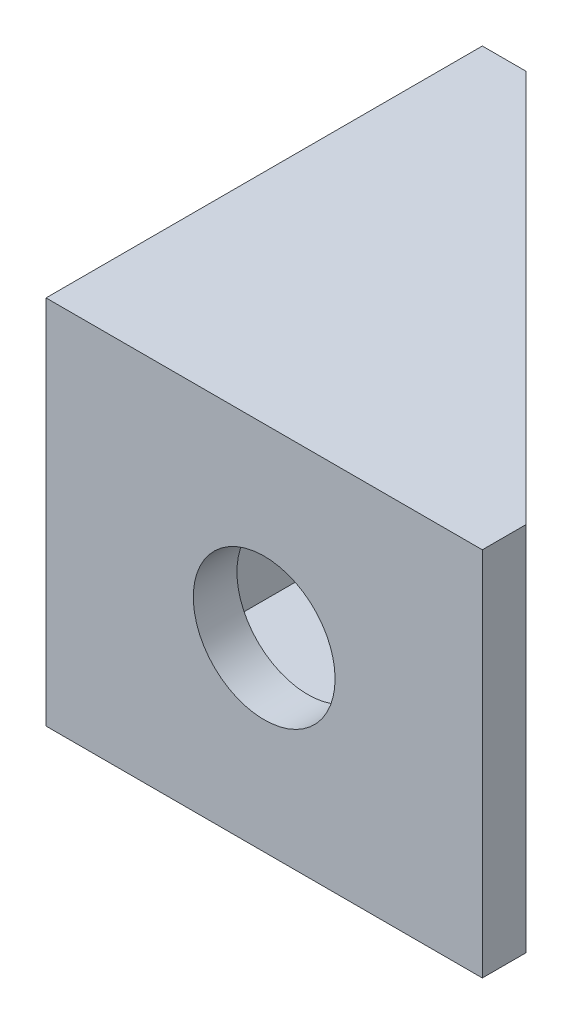
ISO-10303-21;
HEADER;
FILE_DESCRIPTION(('STEP AP214'),'2;1');
FILE_NAME('part.step','',(''),(''),'','','');
FILE_SCHEMA(('AUTOMOTIVE_DESIGN { 1 0 10303 214 1 1 1 1 }'));
ENDSEC;
DATA;
#1=APPLICATION_CONTEXT('core data for automotive mechanical design processes');
#2=APPLICATION_PROTOCOL_DEFINITION('international standard','automotive_design',2000,#1);
#3=PRODUCT_CONTEXT('',#1,'mechanical');
#4=PRODUCT('Part','Part','',(#3));
#5=PRODUCT_RELATED_PRODUCT_CATEGORY('part','',(#4));
#6=PRODUCT_DEFINITION_FORMATION('','',#4);
#7=PRODUCT_DEFINITION_CONTEXT('part definition',#1,'design');
#8=PRODUCT_DEFINITION('design','',#6,#7);
#9=PRODUCT_DEFINITION_SHAPE('','',#8);
#10=(LENGTH_UNIT() NAMED_UNIT(*) SI_UNIT(.MILLI.,.METRE.));
#11=(NAMED_UNIT(*) PLANE_ANGLE_UNIT() SI_UNIT($,.RADIAN.));
#12=(NAMED_UNIT(*) SI_UNIT($,.STERADIAN.) SOLID_ANGLE_UNIT());
#13=UNCERTAINTY_MEASURE_WITH_UNIT(LENGTH_MEASURE(1.E-05),#10,'distance_accuracy_value','');
#14=(GEOMETRIC_REPRESENTATION_CONTEXT(3) GLOBAL_UNCERTAINTY_ASSIGNED_CONTEXT((#13)) GLOBAL_UNIT_ASSIGNED_CONTEXT((#10,
#11,#12)) REPRESENTATION_CONTEXT('',''));
#15=CARTESIAN_POINT('',(0.,0.,0.));
#16=DIRECTION('',(0.,0.,1.));
#17=DIRECTION('',(1.,0.,0.));
#18=AXIS2_PLACEMENT_3D('',#15,#16,#17);
#19=CARTESIAN_POINT('',(0.,0.,-2.));
#20=DIRECTION('',(0.,0.,-1.));
#21=DIRECTION('',(-1.,0.,0.));
#22=AXIS2_PLACEMENT_3D('',#19,#20,#21);
#23=PLANE('',#22);
#24=DIRECTION('',(-1.,0.,0.));
#25=VECTOR('',#24,1.);
#26=CARTESIAN_POINT('',(20.,2.,-2.));
#27=LINE('',#26,#25);
#28=CARTESIAN_POINT('',(20.,2.,-2.));
#29=VERTEX_POINT('',#28);
#30=CARTESIAN_POINT('',(2.,2.,-2.));
#31=VERTEX_POINT('',#30);
#32=EDGE_CURVE('E52',#29,#31,#27,.T.);
#33=ORIENTED_EDGE('',*,*,#32,.T.);
#34=DIRECTION('',(0.,1.,0.));
#35=VECTOR('',#34,1.);
#36=CARTESIAN_POINT('',(2.,0.,-2.));
#37=LINE('',#36,#35);
#38=CARTESIAN_POINT('',(2.,15.,-2.));
#39=VERTEX_POINT('',#38);
#40=EDGE_CURVE('E119',#31,#39,#37,.T.);
#41=ORIENTED_EDGE('',*,*,#40,.T.);
#42=DIRECTION('',(1.,0.,0.));
#43=VECTOR('',#42,1.);
#44=CARTESIAN_POINT('',(20.,15.,-2.));
#45=LINE('',#44,#43);
#46=CARTESIAN_POINT('',(20.,15.,-2.));
#47=VERTEX_POINT('',#46);
#48=EDGE_CURVE('E139',#39,#47,#45,.T.);
#49=ORIENTED_EDGE('',*,*,#48,.T.);
#50=DIRECTION('',(0.,1.,0.));
#51=VECTOR('',#50,1.);
#52=CARTESIAN_POINT('',(20.,0.,-2.));
#53=LINE('',#52,#51);
#54=EDGE_CURVE('E57',#29,#47,#53,.T.);
#55=ORIENTED_EDGE('',*,*,#54,.F.);
#56=EDGE_LOOP('',(#33,#41,#49,#55));
#57=FACE_BOUND('',#56,.T.);
#58=CARTESIAN_POINT('',(10.,8.5,-2.));
#59=DIRECTION('',(0.,0.,1.));
#60=DIRECTION('',(1.,0.,0.));
#61=AXIS2_PLACEMENT_3D('',#58,#59,#60);
#62=CIRCLE('',#61,3.25);
#63=CARTESIAN_POINT('',(13.25,8.5,-2.));
#64=VERTEX_POINT('',#63);
#65=EDGE_CURVE('E162',#64,#64,#62,.T.);
#66=ORIENTED_EDGE('',*,*,#65,.T.);
#67=EDGE_LOOP('',(#66));
#68=FACE_BOUND('',#67,.T.);
#69=ADVANCED_FACE('F35',(#57,#68),#23,.T.);
#70=CARTESIAN_POINT('',(2.,0.,0.));
#71=DIRECTION('',(-1.,0.,0.));
#72=DIRECTION('',(0.,0.,1.));
#73=AXIS2_PLACEMENT_3D('',#70,#71,#72);
#74=PLANE('',#73);
#75=CARTESIAN_POINT('',(2.,8.5,-10.));
#76=DIRECTION('',(1.,0.,0.));
#77=DIRECTION('',(0.,0.,-1.));
#78=AXIS2_PLACEMENT_3D('',#75,#76,#77);
#79=CIRCLE('',#78,3.25);
#80=CARTESIAN_POINT('',(2.,8.5,-13.25));
#81=VERTEX_POINT('',#80);
#82=EDGE_CURVE('E150',#81,#81,#79,.T.);
#83=ORIENTED_EDGE('',*,*,#82,.F.);
#84=EDGE_LOOP('',(#83));
#85=FACE_BOUND('',#84,.T.);
#86=ORIENTED_EDGE('',*,*,#40,.F.);
#87=DIRECTION('',(0.,0.,-1.));
#88=VECTOR('',#87,1.);
#89=CARTESIAN_POINT('',(2.,2.,-2.));
#90=LINE('',#89,#88);
#91=CARTESIAN_POINT('',(2.,2.,-20.));
#92=VERTEX_POINT('',#91);
#93=EDGE_CURVE('E117',#31,#92,#90,.T.);
#94=ORIENTED_EDGE('',*,*,#93,.T.);
#95=DIRECTION('',(0.,1.,0.));
#96=VECTOR('',#95,1.);
#97=CARTESIAN_POINT('',(2.,0.,-20.));
#98=LINE('',#97,#96);
#99=CARTESIAN_POINT('',(2.,15.,-20.));
#100=VERTEX_POINT('',#99);
#101=EDGE_CURVE('E101',#92,#100,#98,.T.);
#102=ORIENTED_EDGE('',*,*,#101,.T.);
#103=DIRECTION('',(0.,0.,1.));
#104=VECTOR('',#103,1.);
#105=CARTESIAN_POINT('',(2.,15.,-2.));
#106=LINE('',#105,#104);
#107=EDGE_CURVE('E137',#100,#39,#106,.T.);
#108=ORIENTED_EDGE('',*,*,#107,.T.);
#109=EDGE_LOOP('',(#86,#94,#102,#108));
#110=FACE_BOUND('',#109,.T.);
#111=ADVANCED_FACE('F118',(#85,#110),#74,.F.);
#112=CARTESIAN_POINT('',(0.,0.,-2.));
#113=DIRECTION('',(-1.,0.,0.));
#114=DIRECTION('',(0.,0.,1.));
#115=AXIS2_PLACEMENT_3D('',#112,#113,#114);
#116=PLANE('',#115);
#117=DIRECTION('',(0.,-1.,0.));
#118=VECTOR('',#117,1.);
#119=CARTESIAN_POINT('',(0.,0.,0.));
#120=LINE('',#119,#118);
#121=CARTESIAN_POINT('',(0.,17.,0.));
#122=VERTEX_POINT('',#121);
#123=CARTESIAN_POINT('',(0.,0.,0.));
#124=VERTEX_POINT('',#123);
#125=EDGE_CURVE('E165',#122,#124,#120,.T.);
#126=ORIENTED_EDGE('',*,*,#125,.F.);
#127=DIRECTION('',(0.,0.,1.));
#128=VECTOR('',#127,1.);
#129=CARTESIAN_POINT('',(0.,17.,-2.));
#130=LINE('',#129,#128);
#131=CARTESIAN_POINT('',(0.,17.,-20.));
#132=VERTEX_POINT('',#131);
#133=EDGE_CURVE('E11',#132,#122,#130,.T.);
#134=ORIENTED_EDGE('',*,*,#133,.F.);
#135=DIRECTION('',(0.,1.,0.));
#136=VECTOR('',#135,1.);
#137=CARTESIAN_POINT('',(0.,0.,-20.));
#138=LINE('',#137,#136);
#139=CARTESIAN_POINT('',(0.,0.,-20.));
#140=VERTEX_POINT('',#139);
#141=EDGE_CURVE('E114',#140,#132,#138,.T.);
#142=ORIENTED_EDGE('',*,*,#141,.F.);
#143=DIRECTION('',(0.,0.,1.));
#144=VECTOR('',#143,1.);
#145=CARTESIAN_POINT('',(0.,0.,-2.));
#146=LINE('',#145,#144);
#147=EDGE_CURVE('E39',#140,#124,#146,.T.);
#148=ORIENTED_EDGE('',*,*,#147,.T.);
#149=EDGE_LOOP('',(#126,#134,#142,#148));
#150=FACE_BOUND('',#149,.T.);
#151=CARTESIAN_POINT('',(0.,8.5,-10.));
#152=DIRECTION('',(1.,0.,0.));
#153=DIRECTION('',(0.,0.,-1.));
#154=AXIS2_PLACEMENT_3D('',#151,#152,#153);
#155=CIRCLE('',#154,3.25);
#156=CARTESIAN_POINT('',(0.,8.5,-13.25));
#157=VERTEX_POINT('',#156);
#158=EDGE_CURVE('E148',#157,#157,#155,.T.);
#159=ORIENTED_EDGE('',*,*,#158,.T.);
#160=EDGE_LOOP('',(#159));
#161=FACE_BOUND('',#160,.T.);
#162=ADVANCED_FACE('F37',(#150,#161),#116,.T.);
#163=CARTESIAN_POINT('',(0.,17.,-2.));
#164=DIRECTION('',(0.,1.,0.));
#165=DIRECTION('',(0.,0.,1.));
#166=AXIS2_PLACEMENT_3D('',#163,#164,#165);
#167=PLANE('',#166);
#168=ORIENTED_EDGE('',*,*,#133,.T.);
#169=DIRECTION('',(-1.,0.,0.));
#170=VECTOR('',#169,1.);
#171=CARTESIAN_POINT('',(0.,17.,0.));
#172=LINE('',#171,#170);
#173=CARTESIAN_POINT('',(20.,17.,0.));
#174=VERTEX_POINT('',#173);
#175=EDGE_CURVE('E177',#174,#122,#172,.T.);
#176=ORIENTED_EDGE('',*,*,#175,.F.);
#177=DIRECTION('',(0.,0.,1.));
#178=VECTOR('',#177,1.);
#179=CARTESIAN_POINT('',(20.,17.,-2.));
#180=LINE('',#179,#178);
#181=CARTESIAN_POINT('',(20.,17.,-2.));
#182=VERTEX_POINT('',#181);
#183=EDGE_CURVE('E44',#182,#174,#180,.T.);
#184=ORIENTED_EDGE('',*,*,#183,.F.);
#185=DIRECTION('',(-0.707106781186547,0.,-0.707106781186547));
#186=VECTOR('',#185,1.);
#187=CARTESIAN_POINT('',(2.,17.,-20.));
#188=LINE('',#187,#186);
#189=CARTESIAN_POINT('',(2.,17.,-20.));
#190=VERTEX_POINT('',#189);
#191=EDGE_CURVE('E133',#182,#190,#188,.T.);
#192=ORIENTED_EDGE('',*,*,#191,.T.);
#193=DIRECTION('',(-1.,0.,0.));
#194=VECTOR('',#193,1.);
#195=CARTESIAN_POINT('',(2.,17.,-20.));
#196=LINE('',#195,#194);
#197=EDGE_CURVE('E130',#190,#132,#196,.T.);
#198=ORIENTED_EDGE('',*,*,#197,.T.);
#199=EDGE_LOOP('',(#168,#176,#184,#192,#198));
#200=FACE_BOUND('',#199,.T.);
#201=ADVANCED_FACE('F195',(#200),#167,.T.);
#202=CARTESIAN_POINT('',(20.,0.,-2.));
#203=DIRECTION('',(1.,0.,0.));
#204=DIRECTION('',(0.,0.,-1.));
#205=AXIS2_PLACEMENT_3D('',#202,#203,#204);
#206=PLANE('',#205);
#207=DIRECTION('',(0.,1.,0.));
#208=VECTOR('',#207,1.);
#209=CARTESIAN_POINT('',(20.,0.,0.));
#210=LINE('',#209,#208);
#211=CARTESIAN_POINT('',(20.,0.,0.));
#212=VERTEX_POINT('',#211);
#213=EDGE_CURVE('E174',#212,#174,#210,.T.);
#214=ORIENTED_EDGE('',*,*,#213,.F.);
#215=DIRECTION('',(0.,0.,1.));
#216=VECTOR('',#215,1.);
#217=CARTESIAN_POINT('',(20.,0.,-2.));
#218=LINE('',#217,#216);
#219=CARTESIAN_POINT('',(20.,0.,-2.));
#220=VERTEX_POINT('',#219);
#221=EDGE_CURVE('E179',#220,#212,#218,.T.);
#222=ORIENTED_EDGE('',*,*,#221,.F.);
#223=EDGE_CURVE('E168',#220,#29,#53,.T.);
#224=ORIENTED_EDGE('',*,*,#223,.T.);
#225=ORIENTED_EDGE('',*,*,#54,.T.);
#226=DIRECTION('',(0.,1.,0.));
#227=VECTOR('',#226,1.);
#228=CARTESIAN_POINT('',(20.,15.,-2.));
#229=LINE('',#228,#227);
#230=EDGE_CURVE('E144',#47,#182,#229,.T.);
#231=ORIENTED_EDGE('',*,*,#230,.T.);
#232=ORIENTED_EDGE('',*,*,#183,.T.);
#233=EDGE_LOOP('',(#214,#222,#224,#225,#231,#232));
#234=FACE_BOUND('',#233,.T.);
#235=ADVANCED_FACE('F202',(#234),#206,.T.);
#236=CARTESIAN_POINT('',(0.,0.,-2.));
#237=DIRECTION('',(0.,-1.,0.));
#238=DIRECTION('',(0.,0.,-1.));
#239=AXIS2_PLACEMENT_3D('',#236,#237,#238);
#240=PLANE('',#239);
#241=DIRECTION('',(-1.,0.,0.));
#242=VECTOR('',#241,1.);
#243=CARTESIAN_POINT('',(2.,0.,-20.));
#244=LINE('',#243,#242);
#245=CARTESIAN_POINT('',(2.,0.,-20.));
#246=VERTEX_POINT('',#245);
#247=EDGE_CURVE('E158',#246,#140,#244,.T.);
#248=ORIENTED_EDGE('',*,*,#247,.F.);
#249=DIRECTION('',(0.707106781186547,0.,0.707106781186547));
#250=VECTOR('',#249,1.);
#251=CARTESIAN_POINT('',(2.,0.,-20.));
#252=LINE('',#251,#250);
#253=EDGE_CURVE('E123',#246,#220,#252,.T.);
#254=ORIENTED_EDGE('',*,*,#253,.T.);
#255=ORIENTED_EDGE('',*,*,#221,.T.);
#256=DIRECTION('',(1.,0.,0.));
#257=VECTOR('',#256,1.);
#258=CARTESIAN_POINT('',(0.,0.,0.));
#259=LINE('',#258,#257);
#260=EDGE_CURVE('E172',#124,#212,#259,.T.);
#261=ORIENTED_EDGE('',*,*,#260,.F.);
#262=ORIENTED_EDGE('',*,*,#147,.F.);
#263=EDGE_LOOP('',(#248,#254,#255,#261,#262));
#264=FACE_BOUND('',#263,.T.);
#265=ADVANCED_FACE('F188',(#264),#240,.T.);
#266=CARTESIAN_POINT('',(0.,0.,0.));
#267=DIRECTION('',(0.,0.,-1.));
#268=DIRECTION('',(-1.,0.,0.));
#269=AXIS2_PLACEMENT_3D('',#266,#267,#268);
#270=PLANE('',#269);
#271=ORIENTED_EDGE('',*,*,#260,.T.);
#272=ORIENTED_EDGE('',*,*,#213,.T.);
#273=ORIENTED_EDGE('',*,*,#175,.T.);
#274=ORIENTED_EDGE('',*,*,#125,.T.);
#275=EDGE_LOOP('',(#271,#272,#273,#274));
#276=FACE_BOUND('',#275,.T.);
#277=CARTESIAN_POINT('',(10.,8.5,0.));
#278=DIRECTION('',(0.,0.,1.));
#279=DIRECTION('',(1.,0.,0.));
#280=AXIS2_PLACEMENT_3D('',#277,#278,#279);
#281=CIRCLE('',#280,3.25);
#282=CARTESIAN_POINT('',(13.25,8.5,0.));
#283=VERTEX_POINT('',#282);
#284=EDGE_CURVE('E161',#283,#283,#281,.T.);
#285=ORIENTED_EDGE('',*,*,#284,.F.);
#286=EDGE_LOOP('',(#285));
#287=FACE_BOUND('',#286,.T.);
#288=ADVANCED_FACE('F190',(#276,#287),#270,.F.);
#289=CARTESIAN_POINT('',(10.,8.5,-2.));
#290=DIRECTION('',(0.,0.,1.));
#291=DIRECTION('',(1.,0.,0.));
#292=AXIS2_PLACEMENT_3D('',#289,#290,#291);
#293=CYLINDRICAL_SURFACE('',#292,3.25);
#294=ORIENTED_EDGE('',*,*,#65,.F.);
#295=EDGE_LOOP('',(#294));
#296=FACE_BOUND('',#295,.T.);
#297=ORIENTED_EDGE('',*,*,#284,.T.);
#298=EDGE_LOOP('',(#297));
#299=FACE_BOUND('',#298,.T.);
#300=ADVANCED_FACE('F211',(#296,#299),#293,.F.);
#301=CARTESIAN_POINT('',(2.,0.,-20.));
#302=DIRECTION('',(0.,0.,1.));
#303=DIRECTION('',(1.,0.,0.));
#304=AXIS2_PLACEMENT_3D('',#301,#302,#303);
#305=PLANE('',#304);
#306=ORIENTED_EDGE('',*,*,#141,.T.);
#307=ORIENTED_EDGE('',*,*,#197,.F.);
#308=DIRECTION('',(0.,1.,0.));
#309=VECTOR('',#308,1.);
#310=CARTESIAN_POINT('',(2.,15.,-20.));
#311=LINE('',#310,#309);
#312=EDGE_CURVE('E110',#100,#190,#311,.T.);
#313=ORIENTED_EDGE('',*,*,#312,.F.);
#314=ORIENTED_EDGE('',*,*,#101,.F.);
#315=EDGE_CURVE('E107',#246,#92,#98,.T.);
#316=ORIENTED_EDGE('',*,*,#315,.F.);
#317=ORIENTED_EDGE('',*,*,#247,.T.);
#318=EDGE_LOOP('',(#306,#307,#313,#314,#316,#317));
#319=FACE_BOUND('',#318,.T.);
#320=ADVANCED_FACE('F104',(#319),#305,.F.);
#321=CARTESIAN_POINT('',(2.,8.5,-10.));
#322=DIRECTION('',(-1.,0.,0.));
#323=DIRECTION('',(0.,0.,1.));
#324=AXIS2_PLACEMENT_3D('',#321,#322,#323);
#325=CYLINDRICAL_SURFACE('',#324,3.25);
#326=ORIENTED_EDGE('',*,*,#82,.T.);
#327=EDGE_LOOP('',(#326));
#328=FACE_BOUND('',#327,.T.);
#329=ORIENTED_EDGE('',*,*,#158,.F.);
#330=EDGE_LOOP('',(#329));
#331=FACE_BOUND('',#330,.T.);
#332=ADVANCED_FACE('F247',(#328,#331),#325,.F.);
#333=CARTESIAN_POINT('',(2.,15.,-20.));
#334=DIRECTION('',(0.707106781186547,0.,-0.707106781186547));
#335=DIRECTION('',(-0.707106781186548,0.,-0.707106781186548));
#336=AXIS2_PLACEMENT_3D('',#333,#334,#335);
#337=PLANE('',#336);
#338=ORIENTED_EDGE('',*,*,#191,.F.);
#339=ORIENTED_EDGE('',*,*,#230,.F.);
#340=DIRECTION('',(-0.707106781186547,0.,-0.707106781186547));
#341=VECTOR('',#340,1.);
#342=CARTESIAN_POINT('',(2.,15.,-20.));
#343=LINE('',#342,#341);
#344=EDGE_CURVE('E141',#47,#100,#343,.T.);
#345=ORIENTED_EDGE('',*,*,#344,.T.);
#346=ORIENTED_EDGE('',*,*,#312,.T.);
#347=EDGE_LOOP('',(#338,#339,#345,#346));
#348=FACE_BOUND('',#347,.T.);
#349=ADVANCED_FACE('F198',(#348),#337,.T.);
#350=CARTESIAN_POINT('',(0.,15.,0.));
#351=DIRECTION('',(0.,1.,0.));
#352=DIRECTION('',(0.,0.,1.));
#353=AXIS2_PLACEMENT_3D('',#350,#351,#352);
#354=PLANE('',#353);
#355=ORIENTED_EDGE('',*,*,#107,.F.);
#356=ORIENTED_EDGE('',*,*,#344,.F.);
#357=ORIENTED_EDGE('',*,*,#48,.F.);
#358=EDGE_LOOP('',(#355,#356,#357));
#359=FACE_BOUND('',#358,.T.);
#360=ADVANCED_FACE('F205',(#359),#354,.F.);
#361=CARTESIAN_POINT('',(2.,2.,-20.));
#362=DIRECTION('',(0.707106781186547,0.,-0.707106781186547));
#363=DIRECTION('',(-0.707106781186548,0.,-0.707106781186548));
#364=AXIS2_PLACEMENT_3D('',#361,#362,#363);
#365=PLANE('',#364);
#366=ORIENTED_EDGE('',*,*,#253,.F.);
#367=ORIENTED_EDGE('',*,*,#315,.T.);
#368=DIRECTION('',(0.707106781186547,0.,0.707106781186547));
#369=VECTOR('',#368,1.);
#370=CARTESIAN_POINT('',(2.,2.,-20.));
#371=LINE('',#370,#369);
#372=EDGE_CURVE('E122',#92,#29,#371,.T.);
#373=ORIENTED_EDGE('',*,*,#372,.T.);
#374=ORIENTED_EDGE('',*,*,#223,.F.);
#375=EDGE_LOOP('',(#366,#367,#373,#374));
#376=FACE_BOUND('',#375,.T.);
#377=ADVANCED_FACE('F127',(#376),#365,.T.);
#378=CARTESIAN_POINT('',(0.,2.,0.));
#379=DIRECTION('',(0.,1.,0.));
#380=DIRECTION('',(0.,0.,1.));
#381=AXIS2_PLACEMENT_3D('',#378,#379,#380);
#382=PLANE('',#381);
#383=ORIENTED_EDGE('',*,*,#93,.F.);
#384=ORIENTED_EDGE('',*,*,#32,.F.);
#385=ORIENTED_EDGE('',*,*,#372,.F.);
#386=EDGE_LOOP('',(#383,#384,#385));
#387=FACE_BOUND('',#386,.T.);
#388=ADVANCED_FACE('F131',(#387),#382,.T.);
#389=CLOSED_SHELL('',(#69,#111,#162,#201,#235,#265,#288,#300,#320,#332,#349,#360,#377,#388));
#390=MANIFOLD_SOLID_BREP('B2',#389);
#391=ADVANCED_BREP_SHAPE_REPRESENTATION('',(#18,#390),#14);
#392=SHAPE_DEFINITION_REPRESENTATION(#9,#391);
ENDSEC;
END-ISO-10303-21;
